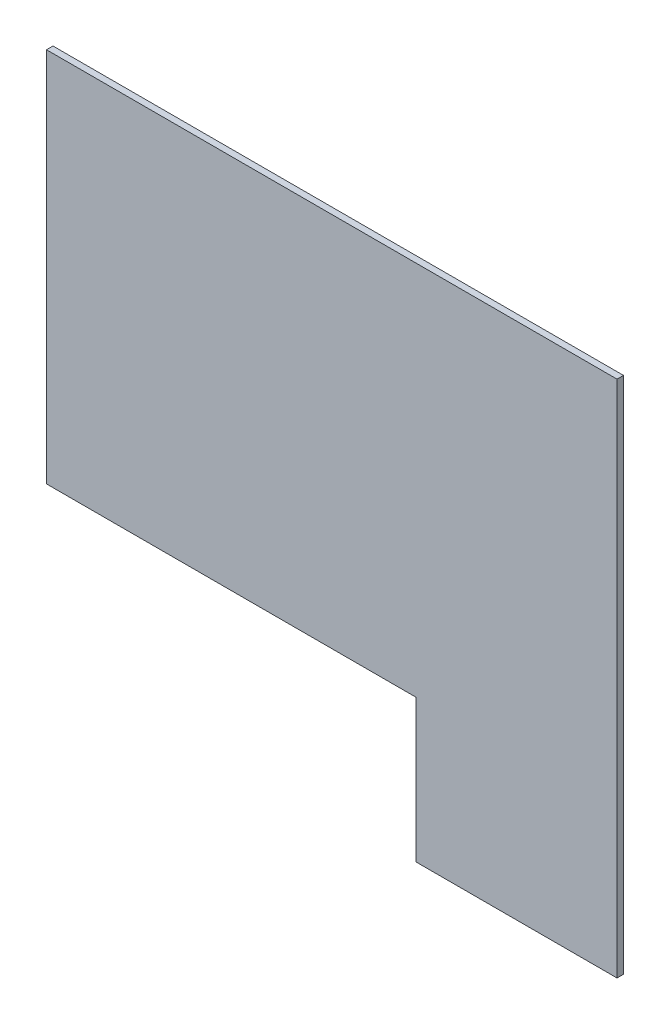
ISO-10303-21;
HEADER;
FILE_DESCRIPTION(('STEP AP214'),'2;1');
FILE_NAME('part.step','',(''),(''),'','','');
FILE_SCHEMA(('AUTOMOTIVE_DESIGN { 1 0 10303 214 1 1 1 1 }'));
ENDSEC;
DATA;
#1=APPLICATION_CONTEXT('core data for automotive mechanical design processes');
#2=APPLICATION_PROTOCOL_DEFINITION('international standard','automotive_design',2000,#1);
#3=PRODUCT_CONTEXT('',#1,'mechanical');
#4=PRODUCT('Part','Part','',(#3));
#5=PRODUCT_RELATED_PRODUCT_CATEGORY('part','',(#4));
#6=PRODUCT_DEFINITION_FORMATION('','',#4);
#7=PRODUCT_DEFINITION_CONTEXT('part definition',#1,'design');
#8=PRODUCT_DEFINITION('design','',#6,#7);
#9=PRODUCT_DEFINITION_SHAPE('','',#8);
#10=(LENGTH_UNIT() NAMED_UNIT(*) SI_UNIT(.MILLI.,.METRE.));
#11=(NAMED_UNIT(*) PLANE_ANGLE_UNIT() SI_UNIT($,.RADIAN.));
#12=(NAMED_UNIT(*) SI_UNIT($,.STERADIAN.) SOLID_ANGLE_UNIT());
#13=UNCERTAINTY_MEASURE_WITH_UNIT(LENGTH_MEASURE(1.E-05),#10,'distance_accuracy_value','');
#14=(GEOMETRIC_REPRESENTATION_CONTEXT(3) GLOBAL_UNCERTAINTY_ASSIGNED_CONTEXT((#13)) GLOBAL_UNIT_ASSIGNED_CONTEXT((#10,
#11,#12)) REPRESENTATION_CONTEXT('',''));
#15=CARTESIAN_POINT('',(0.,0.,0.));
#16=DIRECTION('',(0.,0.,1.));
#17=DIRECTION('',(1.,0.,0.));
#18=AXIS2_PLACEMENT_3D('',#15,#16,#17);
#19=CARTESIAN_POINT('',(143.58670680185,-402.295789036028,5.));
#20=DIRECTION('',(0.,1.,0.));
#21=DIRECTION('',(-1.,0.,0.));
#22=AXIS2_PLACEMENT_3D('',#19,#20,#21);
#23=PLANE('',#22);
#24=DIRECTION('',(1.,0.,0.));
#25=VECTOR('',#24,1.);
#26=CARTESIAN_POINT('',(143.58670680185,-402.295789036028,0.));
#27=LINE('',#26,#25);
#28=CARTESIAN_POINT('',(73.5867068018496,-402.295789036028,0.));
#29=VERTEX_POINT('',#28);
#30=CARTESIAN_POINT('',(228.58670680185,-402.295789036028,0.));
#31=VERTEX_POINT('',#30);
#32=EDGE_CURVE('E78',#29,#31,#27,.T.);
#33=ORIENTED_EDGE('',*,*,#32,.T.);
#34=DIRECTION('',(0.,0.,-1.));
#35=VECTOR('',#34,1.);
#36=CARTESIAN_POINT('',(228.58670680185,-402.295789036028,5.));
#37=LINE('',#36,#35);
#38=CARTESIAN_POINT('',(228.58670680185,-402.295789036028,5.));
#39=VERTEX_POINT('',#38);
#40=EDGE_CURVE('E11',#39,#31,#37,.T.);
#41=ORIENTED_EDGE('',*,*,#40,.F.);
#42=DIRECTION('',(1.,0.,0.));
#43=VECTOR('',#42,1.);
#44=CARTESIAN_POINT('',(143.58670680185,-402.295789036028,5.));
#45=LINE('',#44,#43);
#46=CARTESIAN_POINT('',(73.5867068018496,-402.295789036028,5.));
#47=VERTEX_POINT('',#46);
#48=EDGE_CURVE('E84',#47,#39,#45,.T.);
#49=ORIENTED_EDGE('',*,*,#48,.F.);
#50=DIRECTION('',(0.,0.,-1.));
#51=VECTOR('',#50,1.);
#52=CARTESIAN_POINT('',(73.5867068018496,-402.295789036028,5.));
#53=LINE('',#52,#51);
#54=EDGE_CURVE('E112',#47,#29,#53,.T.);
#55=ORIENTED_EDGE('',*,*,#54,.T.);
#56=EDGE_LOOP('',(#33,#41,#49,#55));
#57=FACE_BOUND('',#56,.T.);
#58=ADVANCED_FACE('F32',(#57),#23,.F.);
#59=CARTESIAN_POINT('',(228.58670680185,-2.29578903602801,5.));
#60=DIRECTION('',(-1.,0.,0.));
#61=DIRECTION('',(0.,0.,1.));
#62=AXIS2_PLACEMENT_3D('',#59,#60,#61);
#63=PLANE('',#62);
#64=DIRECTION('',(0.,1.,0.));
#65=VECTOR('',#64,1.);
#66=CARTESIAN_POINT('',(228.58670680185,-2.29578903602801,0.));
#67=LINE('',#66,#65);
#68=CARTESIAN_POINT('',(228.58670680185,-2.29578903602801,0.));
#69=VERTEX_POINT('',#68);
#70=EDGE_CURVE('E117',#31,#69,#67,.T.);
#71=ORIENTED_EDGE('',*,*,#70,.T.);
#72=DIRECTION('',(0.,0.,-1.));
#73=VECTOR('',#72,1.);
#74=CARTESIAN_POINT('',(228.58670680185,-2.29578903602801,5.));
#75=LINE('',#74,#73);
#76=CARTESIAN_POINT('',(228.58670680185,-2.29578903602801,5.));
#77=VERTEX_POINT('',#76);
#78=EDGE_CURVE('E40',#77,#69,#75,.T.);
#79=ORIENTED_EDGE('',*,*,#78,.F.);
#80=DIRECTION('',(0.,1.,0.));
#81=VECTOR('',#80,1.);
#82=CARTESIAN_POINT('',(228.58670680185,-2.29578903602801,5.));
#83=LINE('',#82,#81);
#84=EDGE_CURVE('E139',#39,#77,#83,.T.);
#85=ORIENTED_EDGE('',*,*,#84,.F.);
#86=ORIENTED_EDGE('',*,*,#40,.T.);
#87=EDGE_LOOP('',(#71,#79,#85,#86));
#88=FACE_BOUND('',#87,.T.);
#89=ADVANCED_FACE('F142',(#88),#63,.F.);
#90=CARTESIAN_POINT('',(228.58670680185,-2.29578903602801,5.));
#91=DIRECTION('',(0.,-1.,0.));
#92=DIRECTION('',(0.,0.,-1.));
#93=AXIS2_PLACEMENT_3D('',#90,#91,#92);
#94=PLANE('',#93);
#95=DIRECTION('',(-1.,0.,0.));
#96=VECTOR('',#95,1.);
#97=CARTESIAN_POINT('',(228.58670680185,-2.29578903602801,0.));
#98=LINE('',#97,#96);
#99=CARTESIAN_POINT('',(-211.41329319815,-2.29578903602801,0.));
#100=VERTEX_POINT('',#99);
#101=EDGE_CURVE('E119',#69,#100,#98,.T.);
#102=ORIENTED_EDGE('',*,*,#101,.T.);
#103=DIRECTION('',(0.,0.,-1.));
#104=VECTOR('',#103,1.);
#105=CARTESIAN_POINT('',(-211.41329319815,-2.29578903602801,5.));
#106=LINE('',#105,#104);
#107=CARTESIAN_POINT('',(-211.41329319815,-2.29578903602801,5.));
#108=VERTEX_POINT('',#107);
#109=EDGE_CURVE('E107',#108,#100,#106,.T.);
#110=ORIENTED_EDGE('',*,*,#109,.F.);
#111=DIRECTION('',(-1.,0.,0.));
#112=VECTOR('',#111,1.);
#113=CARTESIAN_POINT('',(228.58670680185,-2.29578903602801,5.));
#114=LINE('',#113,#112);
#115=EDGE_CURVE('E98',#77,#108,#114,.T.);
#116=ORIENTED_EDGE('',*,*,#115,.F.);
#117=ORIENTED_EDGE('',*,*,#78,.T.);
#118=EDGE_LOOP('',(#102,#110,#116,#117));
#119=FACE_BOUND('',#118,.T.);
#120=ADVANCED_FACE('F132',(#119),#94,.F.);
#121=CARTESIAN_POINT('',(-211.41329319815,-2.29578903602801,5.));
#122=DIRECTION('',(1.,0.,0.));
#123=DIRECTION('',(0.,0.,-1.));
#124=AXIS2_PLACEMENT_3D('',#121,#122,#123);
#125=PLANE('',#124);
#126=DIRECTION('',(0.,-1.,0.));
#127=VECTOR('',#126,1.);
#128=CARTESIAN_POINT('',(-211.41329319815,-2.29578903602801,0.));
#129=LINE('',#128,#127);
#130=CARTESIAN_POINT('',(-211.41329319815,-292.295789036028,0.));
#131=VERTEX_POINT('',#130);
#132=EDGE_CURVE('E106',#100,#131,#129,.T.);
#133=ORIENTED_EDGE('',*,*,#132,.T.);
#134=DIRECTION('',(0.,0.,-1.));
#135=VECTOR('',#134,1.);
#136=CARTESIAN_POINT('',(-211.41329319815,-292.295789036028,4.99999999999995));
#137=LINE('',#136,#135);
#138=CARTESIAN_POINT('',(-211.41329319815,-292.295789036028,4.99999999999995));
#139=VERTEX_POINT('',#138);
#140=EDGE_CURVE('E103',#139,#131,#137,.T.);
#141=ORIENTED_EDGE('',*,*,#140,.F.);
#142=DIRECTION('',(0.,-1.,0.));
#143=VECTOR('',#142,1.);
#144=CARTESIAN_POINT('',(-211.41329319815,-2.29578903602801,5.));
#145=LINE('',#144,#143);
#146=EDGE_CURVE('E92',#108,#139,#145,.T.);
#147=ORIENTED_EDGE('',*,*,#146,.F.);
#148=ORIENTED_EDGE('',*,*,#109,.T.);
#149=EDGE_LOOP('',(#133,#141,#147,#148));
#150=FACE_BOUND('',#149,.T.);
#151=ADVANCED_FACE('F104',(#150),#125,.F.);
#152=CARTESIAN_POINT('',(-211.41329319815,-292.295789036028,4.99999999999995));
#153=DIRECTION('',(0.,1.,0.));
#154=DIRECTION('',(-1.,0.,0.));
#155=AXIS2_PLACEMENT_3D('',#152,#153,#154);
#156=PLANE('',#155);
#157=DIRECTION('',(1.,0.,0.));
#158=VECTOR('',#157,1.);
#159=CARTESIAN_POINT('',(-211.41329319815,-292.295789036028,0.));
#160=LINE('',#159,#158);
#161=CARTESIAN_POINT('',(73.5867068018496,-292.295789036028,0.));
#162=VERTEX_POINT('',#161);
#163=EDGE_CURVE('E71',#131,#162,#160,.T.);
#164=ORIENTED_EDGE('',*,*,#163,.T.);
#165=DIRECTION('',(0.,0.,-1.));
#166=VECTOR('',#165,1.);
#167=CARTESIAN_POINT('',(73.5867068018496,-292.295789036028,5.));
#168=LINE('',#167,#166);
#169=CARTESIAN_POINT('',(73.5867068018496,-292.295789036028,5.));
#170=VERTEX_POINT('',#169);
#171=EDGE_CURVE('E108',#170,#162,#168,.T.);
#172=ORIENTED_EDGE('',*,*,#171,.F.);
#173=DIRECTION('',(1.,0.,0.));
#174=VECTOR('',#173,1.);
#175=CARTESIAN_POINT('',(-211.41329319815,-292.295789036028,4.99999999999995));
#176=LINE('',#175,#174);
#177=EDGE_CURVE('E96',#139,#170,#176,.T.);
#178=ORIENTED_EDGE('',*,*,#177,.F.);
#179=ORIENTED_EDGE('',*,*,#140,.T.);
#180=EDGE_LOOP('',(#164,#172,#178,#179));
#181=FACE_BOUND('',#180,.T.);
#182=ADVANCED_FACE('F110',(#181),#156,.F.);
#183=CARTESIAN_POINT('',(73.5867068018496,-402.295789036028,5.));
#184=DIRECTION('',(1.,0.,0.));
#185=DIRECTION('',(0.,1.,0.));
#186=AXIS2_PLACEMENT_3D('',#183,#184,#185);
#187=PLANE('',#186);
#188=DIRECTION('',(0.,-1.,0.));
#189=VECTOR('',#188,1.);
#190=CARTESIAN_POINT('',(73.5867068018496,-402.295789036028,0.));
#191=LINE('',#190,#189);
#192=EDGE_CURVE('E123',#162,#29,#191,.T.);
#193=ORIENTED_EDGE('',*,*,#192,.T.);
#194=ORIENTED_EDGE('',*,*,#54,.F.);
#195=DIRECTION('',(0.,-1.,0.));
#196=VECTOR('',#195,1.);
#197=CARTESIAN_POINT('',(73.5867068018496,-402.295789036028,5.));
#198=LINE('',#197,#196);
#199=EDGE_CURVE('E48',#170,#47,#198,.T.);
#200=ORIENTED_EDGE('',*,*,#199,.F.);
#201=ORIENTED_EDGE('',*,*,#171,.T.);
#202=EDGE_LOOP('',(#193,#194,#200,#201));
#203=FACE_BOUND('',#202,.T.);
#204=ADVANCED_FACE('F137',(#203),#187,.F.);
#205=CARTESIAN_POINT('',(0.,0.,5.));
#206=DIRECTION('',(0.,0.,-1.));
#207=DIRECTION('',(-1.,0.,0.));
#208=AXIS2_PLACEMENT_3D('',#205,#206,#207);
#209=PLANE('',#208);
#210=ORIENTED_EDGE('',*,*,#48,.T.);
#211=ORIENTED_EDGE('',*,*,#84,.T.);
#212=ORIENTED_EDGE('',*,*,#115,.T.);
#213=ORIENTED_EDGE('',*,*,#146,.T.);
#214=ORIENTED_EDGE('',*,*,#177,.T.);
#215=ORIENTED_EDGE('',*,*,#199,.T.);
#216=EDGE_LOOP('',(#210,#211,#212,#213,#214,#215));
#217=FACE_BOUND('',#216,.T.);
#218=ADVANCED_FACE('F94',(#217),#209,.F.);
#219=CARTESIAN_POINT('',(0.,0.,0.));
#220=DIRECTION('',(0.,0.,-1.));
#221=DIRECTION('',(-1.,0.,0.));
#222=AXIS2_PLACEMENT_3D('',#219,#220,#221);
#223=PLANE('',#222);
#224=ORIENTED_EDGE('',*,*,#32,.F.);
#225=ORIENTED_EDGE('',*,*,#192,.F.);
#226=ORIENTED_EDGE('',*,*,#163,.F.);
#227=ORIENTED_EDGE('',*,*,#132,.F.);
#228=ORIENTED_EDGE('',*,*,#101,.F.);
#229=ORIENTED_EDGE('',*,*,#70,.F.);
#230=EDGE_LOOP('',(#224,#225,#226,#227,#228,#229));
#231=FACE_BOUND('',#230,.T.);
#232=ADVANCED_FACE('F135',(#231),#223,.T.);
#233=CLOSED_SHELL('',(#58,#89,#120,#151,#182,#204,#218,#232));
#234=MANIFOLD_SOLID_BREP('B2',#233);
#235=ADVANCED_BREP_SHAPE_REPRESENTATION('',(#18,#234),#14);
#236=SHAPE_DEFINITION_REPRESENTATION(#9,#235);
ENDSEC;
END-ISO-10303-21;
